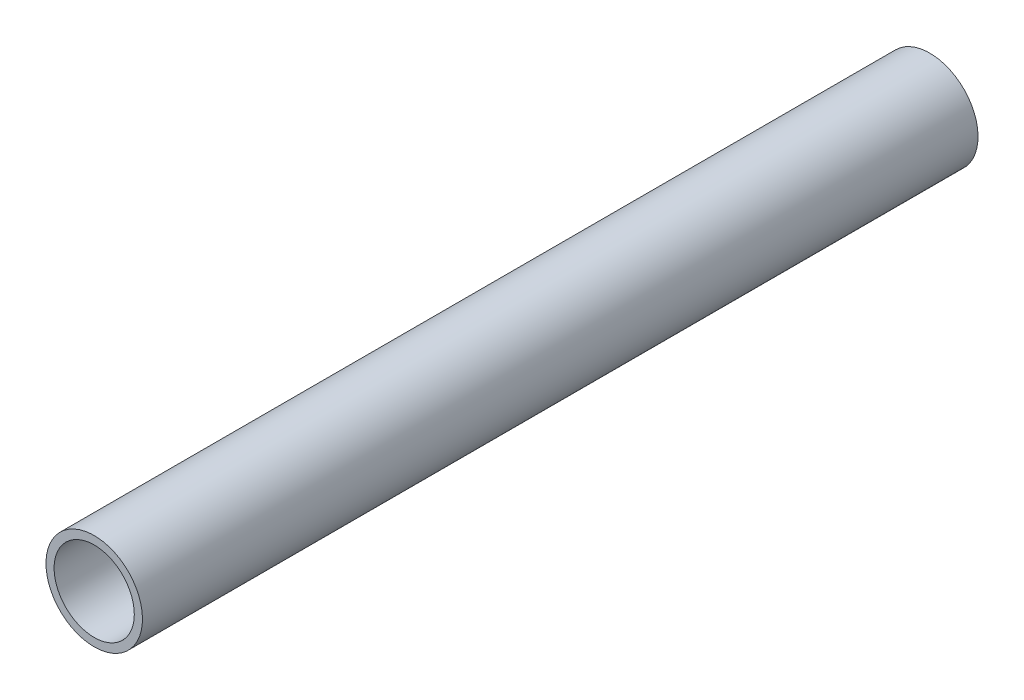
ISO-10303-21;
HEADER;
FILE_DESCRIPTION(('STEP AP214'),'2;1');
FILE_NAME('part.step','',(''),(''),'','','');
FILE_SCHEMA(('AUTOMOTIVE_DESIGN { 1 0 10303 214 1 1 1 1 }'));
ENDSEC;
DATA;
#1=APPLICATION_CONTEXT('core data for automotive mechanical design processes');
#2=APPLICATION_PROTOCOL_DEFINITION('international standard','automotive_design',2000,#1);
#3=PRODUCT_CONTEXT('',#1,'mechanical');
#4=PRODUCT('Part','Part','',(#3));
#5=PRODUCT_RELATED_PRODUCT_CATEGORY('part','',(#4));
#6=PRODUCT_DEFINITION_FORMATION('','',#4);
#7=PRODUCT_DEFINITION_CONTEXT('part definition',#1,'design');
#8=PRODUCT_DEFINITION('design','',#6,#7);
#9=PRODUCT_DEFINITION_SHAPE('','',#8);
#10=(LENGTH_UNIT() NAMED_UNIT(*) SI_UNIT(.MILLI.,.METRE.));
#11=(NAMED_UNIT(*) PLANE_ANGLE_UNIT() SI_UNIT($,.RADIAN.));
#12=(NAMED_UNIT(*) SI_UNIT($,.STERADIAN.) SOLID_ANGLE_UNIT());
#13=UNCERTAINTY_MEASURE_WITH_UNIT(LENGTH_MEASURE(1.E-05),#10,'distance_accuracy_value','');
#14=(GEOMETRIC_REPRESENTATION_CONTEXT(3) GLOBAL_UNCERTAINTY_ASSIGNED_CONTEXT((#13)) GLOBAL_UNIT_ASSIGNED_CONTEXT((#10,
#11,#12)) REPRESENTATION_CONTEXT('',''));
#15=CARTESIAN_POINT('',(0.,0.,0.));
#16=DIRECTION('',(0.,0.,1.));
#17=DIRECTION('',(1.,0.,0.));
#18=AXIS2_PLACEMENT_3D('',#15,#16,#17);
#19=CARTESIAN_POINT('',(0.,0.,0.));
#20=DIRECTION('',(0.,0.,1.));
#21=DIRECTION('',(1.,0.,0.));
#22=AXIS2_PLACEMENT_3D('',#19,#20,#21);
#23=CYLINDRICAL_SURFACE('',#22,17.526);
#24=CARTESIAN_POINT('',(0.,0.,365.252));
#25=DIRECTION('',(0.,0.,1.));
#26=DIRECTION('',(1.,0.,0.));
#27=AXIS2_PLACEMENT_3D('',#24,#25,#26);
#28=CIRCLE('',#27,17.526);
#29=CARTESIAN_POINT('',(17.526,0.,365.252));
#30=VERTEX_POINT('',#29);
#31=EDGE_CURVE('E9',#30,#30,#28,.T.);
#32=ORIENTED_EDGE('',*,*,#31,.T.);
#33=EDGE_LOOP('',(#32));
#34=FACE_BOUND('',#33,.T.);
#35=CARTESIAN_POINT('',(0.,0.,0.));
#36=DIRECTION('',(0.,0.,1.));
#37=DIRECTION('',(1.,0.,0.));
#38=AXIS2_PLACEMENT_3D('',#35,#36,#37);
#39=CIRCLE('',#38,17.526);
#40=CARTESIAN_POINT('',(17.526,0.,0.));
#41=VERTEX_POINT('',#40);
#42=EDGE_CURVE('E27',#41,#41,#39,.T.);
#43=ORIENTED_EDGE('',*,*,#42,.F.);
#44=EDGE_LOOP('',(#43));
#45=FACE_BOUND('',#44,.T.);
#46=ADVANCED_FACE('F14',(#34,#45),#23,.F.);
#47=CARTESIAN_POINT('',(0.,0.,0.));
#48=DIRECTION('',(0.,0.,1.));
#49=DIRECTION('',(1.,0.,0.));
#50=AXIS2_PLACEMENT_3D('',#47,#48,#49);
#51=CYLINDRICAL_SURFACE('',#50,21.082);
#52=CARTESIAN_POINT('',(0.,0.,365.252));
#53=DIRECTION('',(0.,0.,-1.));
#54=DIRECTION('',(0.,-1.,0.));
#55=AXIS2_PLACEMENT_3D('',#52,#53,#54);
#56=CIRCLE('',#55,21.082);
#57=CARTESIAN_POINT('',(0.,-21.082,365.252));
#58=VERTEX_POINT('',#57);
#59=EDGE_CURVE('E21',#58,#58,#56,.T.);
#60=ORIENTED_EDGE('',*,*,#59,.T.);
#61=EDGE_LOOP('',(#60));
#62=FACE_BOUND('',#61,.T.);
#63=CARTESIAN_POINT('',(0.,0.,0.));
#64=DIRECTION('',(0.,0.,-1.));
#65=DIRECTION('',(0.,-1.,0.));
#66=AXIS2_PLACEMENT_3D('',#63,#64,#65);
#67=CIRCLE('',#66,21.082);
#68=CARTESIAN_POINT('',(0.,-21.082,0.));
#69=VERTEX_POINT('',#68);
#70=EDGE_CURVE('E17',#69,#69,#67,.T.);
#71=ORIENTED_EDGE('',*,*,#70,.F.);
#72=EDGE_LOOP('',(#71));
#73=FACE_BOUND('',#72,.T.);
#74=ADVANCED_FACE('F36',(#62,#73),#51,.T.);
#75=CARTESIAN_POINT('',(0.,0.,0.));
#76=DIRECTION('',(0.,0.,1.));
#77=DIRECTION('',(1.,0.,0.));
#78=AXIS2_PLACEMENT_3D('',#75,#76,#77);
#79=PLANE('',#78);
#80=ORIENTED_EDGE('',*,*,#70,.T.);
#81=EDGE_LOOP('',(#80));
#82=FACE_BOUND('',#81,.T.);
#83=ORIENTED_EDGE('',*,*,#42,.T.);
#84=EDGE_LOOP('',(#83));
#85=FACE_BOUND('',#84,.T.);
#86=ADVANCED_FACE('F34',(#82,#85),#79,.F.);
#87=CARTESIAN_POINT('',(0.,0.,365.252));
#88=DIRECTION('',(0.,0.,1.));
#89=DIRECTION('',(1.,0.,0.));
#90=AXIS2_PLACEMENT_3D('',#87,#88,#89);
#91=PLANE('',#90);
#92=ORIENTED_EDGE('',*,*,#59,.F.);
#93=EDGE_LOOP('',(#92));
#94=FACE_BOUND('',#93,.T.);
#95=ORIENTED_EDGE('',*,*,#31,.F.);
#96=EDGE_LOOP('',(#95));
#97=FACE_BOUND('',#96,.T.);
#98=ADVANCED_FACE('F44',(#94,#97),#91,.T.);
#99=CLOSED_SHELL('',(#46,#74,#86,#98));
#100=MANIFOLD_SOLID_BREP('B1',#99);
#101=ADVANCED_BREP_SHAPE_REPRESENTATION('',(#18,#100),#14);
#102=SHAPE_DEFINITION_REPRESENTATION(#9,#101);
ENDSEC;
END-ISO-10303-21;
